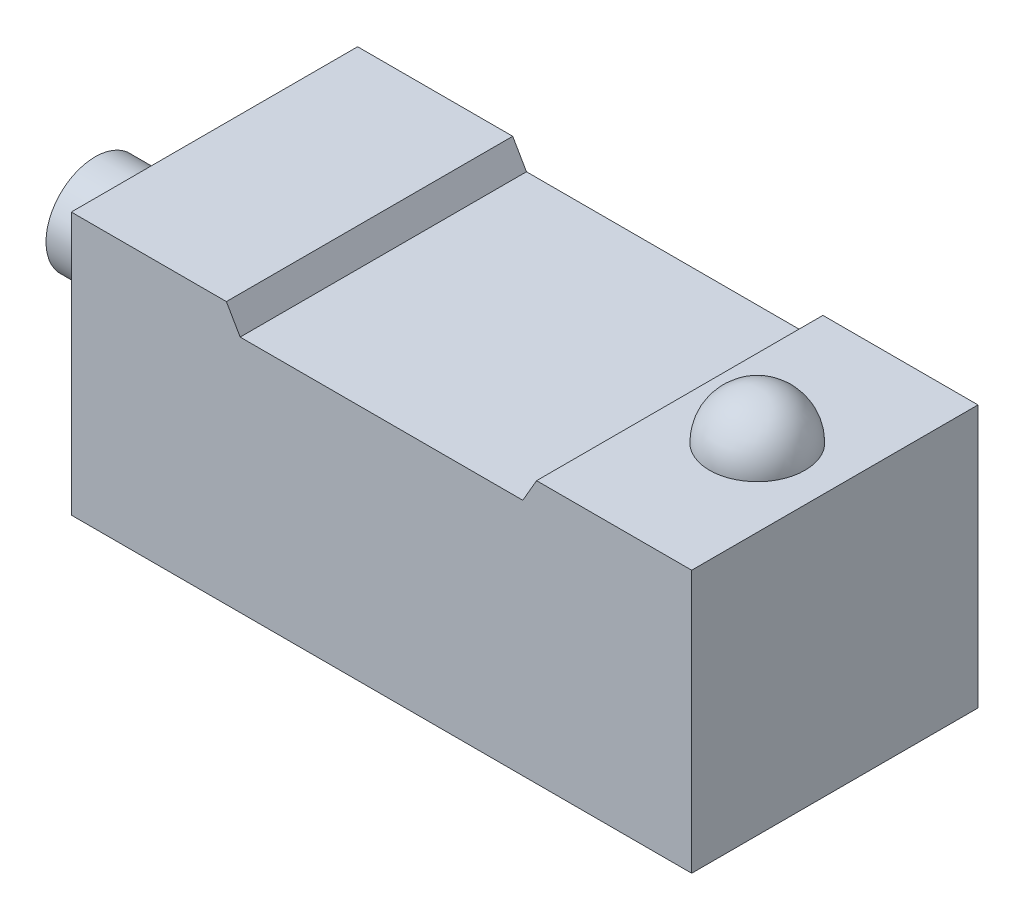
ISO-10303-21;
HEADER;
FILE_DESCRIPTION(('STEP AP214'),'2;1');
FILE_NAME('part.step','',(''),(''),'','','');
FILE_SCHEMA(('AUTOMOTIVE_DESIGN { 1 0 10303 214 1 1 1 1 }'));
ENDSEC;
DATA;
#1=APPLICATION_CONTEXT('core data for automotive mechanical design processes');
#2=APPLICATION_PROTOCOL_DEFINITION('international standard','automotive_design',2000,#1);
#3=PRODUCT_CONTEXT('',#1,'mechanical');
#4=PRODUCT('Part','Part','',(#3));
#5=PRODUCT_RELATED_PRODUCT_CATEGORY('part','',(#4));
#6=PRODUCT_DEFINITION_FORMATION('','',#4);
#7=PRODUCT_DEFINITION_CONTEXT('part definition',#1,'design');
#8=PRODUCT_DEFINITION('design','',#6,#7);
#9=PRODUCT_DEFINITION_SHAPE('','',#8);
#10=(LENGTH_UNIT() NAMED_UNIT(*) SI_UNIT(.MILLI.,.METRE.));
#11=(NAMED_UNIT(*) PLANE_ANGLE_UNIT() SI_UNIT($,.RADIAN.));
#12=(NAMED_UNIT(*) SI_UNIT($,.STERADIAN.) SOLID_ANGLE_UNIT());
#13=UNCERTAINTY_MEASURE_WITH_UNIT(LENGTH_MEASURE(1.E-05),#10,'distance_accuracy_value','');
#14=(GEOMETRIC_REPRESENTATION_CONTEXT(3) GLOBAL_UNCERTAINTY_ASSIGNED_CONTEXT((#13)) GLOBAL_UNIT_ASSIGNED_CONTEXT((#10,
#11,#12)) REPRESENTATION_CONTEXT('',''));
#15=CARTESIAN_POINT('',(0.,0.,0.));
#16=DIRECTION('',(0.,0.,1.));
#17=DIRECTION('',(1.,0.,0.));
#18=AXIS2_PLACEMENT_3D('',#15,#16,#17);
#19=CARTESIAN_POINT('',(-13.,11.,6.));
#20=DIRECTION('',(1.,0.,0.));
#21=DIRECTION('',(0.,0.,-1.));
#22=AXIS2_PLACEMENT_3D('',#19,#20,#21);
#23=PLANE('',#22);
#24=DIRECTION('',(0.,0.,1.));
#25=VECTOR('',#24,1.);
#26=CARTESIAN_POINT('',(-13.,0.,6.));
#27=LINE('',#26,#25);
#28=CARTESIAN_POINT('',(-13.,0.,-6.));
#29=VERTEX_POINT('',#28);
#30=CARTESIAN_POINT('',(-13.,0.,6.));
#31=VERTEX_POINT('',#30);
#32=EDGE_CURVE('E145',#29,#31,#27,.T.);
#33=ORIENTED_EDGE('',*,*,#32,.T.);
#34=DIRECTION('',(0.,-1.,0.));
#35=VECTOR('',#34,1.);
#36=CARTESIAN_POINT('',(-13.,11.,6.));
#37=LINE('',#36,#35);
#38=CARTESIAN_POINT('',(-13.,11.,6.));
#39=VERTEX_POINT('',#38);
#40=EDGE_CURVE('E134',#39,#31,#37,.T.);
#41=ORIENTED_EDGE('',*,*,#40,.F.);
#42=DIRECTION('',(0.,0.,1.));
#43=VECTOR('',#42,1.);
#44=CARTESIAN_POINT('',(-13.,11.,6.));
#45=LINE('',#44,#43);
#46=CARTESIAN_POINT('',(-13.,11.,-6.));
#47=VERTEX_POINT('',#46);
#48=EDGE_CURVE('E130',#47,#39,#45,.T.);
#49=ORIENTED_EDGE('',*,*,#48,.F.);
#50=DIRECTION('',(0.,-1.,0.));
#51=VECTOR('',#50,1.);
#52=CARTESIAN_POINT('',(-13.,11.,-6.));
#53=LINE('',#52,#51);
#54=EDGE_CURVE('E150',#47,#29,#53,.T.);
#55=ORIENTED_EDGE('',*,*,#54,.T.);
#56=EDGE_LOOP('',(#33,#41,#49,#55));
#57=FACE_BOUND('',#56,.T.);
#58=CARTESIAN_POINT('',(-13.,5.44549622085863,0.));
#59=DIRECTION('',(1.,0.,0.));
#60=DIRECTION('',(0.,0.,-1.));
#61=AXIS2_PLACEMENT_3D('',#58,#59,#60);
#62=CIRCLE('',#61,2.06006299232232);
#63=CARTESIAN_POINT('',(-13.,5.44549622085863,-2.06006299232232));
#64=VERTEX_POINT('',#63);
#65=EDGE_CURVE('E11',#64,#64,#62,.F.);
#66=ORIENTED_EDGE('',*,*,#65,.F.);
#67=EDGE_LOOP('',(#66));
#68=FACE_BOUND('',#67,.T.);
#69=ADVANCED_FACE('F34',(#57,#68),#23,.F.);
#70=CARTESIAN_POINT('',(13.,11.,-6.));
#71=DIRECTION('',(0.,-1.,0.));
#72=DIRECTION('',(0.,0.,-1.));
#73=AXIS2_PLACEMENT_3D('',#70,#71,#72);
#74=PLANE('',#73);
#75=DIRECTION('',(-1.,0.,0.));
#76=VECTOR('',#75,1.);
#77=CARTESIAN_POINT('',(-13.,11.,-6.));
#78=LINE('',#77,#76);
#79=CARTESIAN_POINT('',(13.,11.,-6.));
#80=VERTEX_POINT('',#79);
#81=CARTESIAN_POINT('',(6.5,11.,-6.));
#82=VERTEX_POINT('',#81);
#83=EDGE_CURVE('E88',#80,#82,#78,.T.);
#84=ORIENTED_EDGE('',*,*,#83,.T.);
#85=DIRECTION('',(0.,0.,1.));
#86=VECTOR('',#85,1.);
#87=CARTESIAN_POINT('',(6.5,11.,-6.));
#88=LINE('',#87,#86);
#89=CARTESIAN_POINT('',(6.5,11.,6.));
#90=VERTEX_POINT('',#89);
#91=EDGE_CURVE('E117',#82,#90,#88,.T.);
#92=ORIENTED_EDGE('',*,*,#91,.T.);
#93=DIRECTION('',(1.,0.,0.));
#94=VECTOR('',#93,1.);
#95=CARTESIAN_POINT('',(-13.,11.,6.));
#96=LINE('',#95,#94);
#97=CARTESIAN_POINT('',(13.,11.,6.));
#98=VERTEX_POINT('',#97);
#99=EDGE_CURVE('E58',#90,#98,#96,.T.);
#100=ORIENTED_EDGE('',*,*,#99,.T.);
#101=DIRECTION('',(0.,0.,-1.));
#102=VECTOR('',#101,1.);
#103=CARTESIAN_POINT('',(13.,11.,6.));
#104=LINE('',#103,#102);
#105=EDGE_CURVE('E147',#98,#80,#104,.T.);
#106=ORIENTED_EDGE('',*,*,#105,.T.);
#107=EDGE_LOOP('',(#84,#92,#100,#106));
#108=FACE_BOUND('',#107,.T.);
#109=CARTESIAN_POINT('',(9.75,11.,0.));
#110=DIRECTION('',(0.,-1.,0.));
#111=DIRECTION('',(0.,0.,-1.));
#112=AXIS2_PLACEMENT_3D('',#109,#110,#111);
#113=CIRCLE('',#112,2.);
#114=CARTESIAN_POINT('',(9.75,11.,-2.));
#115=VERTEX_POINT('',#114);
#116=EDGE_CURVE('E42',#115,#115,#113,.F.);
#117=ORIENTED_EDGE('',*,*,#116,.F.);
#118=EDGE_LOOP('',(#117));
#119=FACE_BOUND('',#118,.T.);
#120=ADVANCED_FACE('F160',(#108,#119),#74,.F.);
#121=CARTESIAN_POINT('',(13.,11.,6.));
#122=DIRECTION('',(-1.,0.,0.));
#123=DIRECTION('',(0.,0.,1.));
#124=AXIS2_PLACEMENT_3D('',#121,#122,#123);
#125=PLANE('',#124);
#126=DIRECTION('',(0.,0.,-1.));
#127=VECTOR('',#126,1.);
#128=CARTESIAN_POINT('',(13.,0.,6.));
#129=LINE('',#128,#127);
#130=CARTESIAN_POINT('',(13.,0.,6.));
#131=VERTEX_POINT('',#130);
#132=CARTESIAN_POINT('',(13.,0.,-6.));
#133=VERTEX_POINT('',#132);
#134=EDGE_CURVE('E139',#131,#133,#129,.T.);
#135=ORIENTED_EDGE('',*,*,#134,.T.);
#136=DIRECTION('',(0.,-1.,0.));
#137=VECTOR('',#136,1.);
#138=CARTESIAN_POINT('',(13.,11.,-6.));
#139=LINE('',#138,#137);
#140=EDGE_CURVE('E118',#80,#133,#139,.T.);
#141=ORIENTED_EDGE('',*,*,#140,.F.);
#142=ORIENTED_EDGE('',*,*,#105,.F.);
#143=DIRECTION('',(0.,-1.,0.));
#144=VECTOR('',#143,1.);
#145=CARTESIAN_POINT('',(13.,11.,6.));
#146=LINE('',#145,#144);
#147=EDGE_CURVE('E132',#98,#131,#146,.T.);
#148=ORIENTED_EDGE('',*,*,#147,.T.);
#149=EDGE_LOOP('',(#135,#141,#142,#148));
#150=FACE_BOUND('',#149,.T.);
#151=ADVANCED_FACE('F36',(#150),#125,.F.);
#152=CARTESIAN_POINT('',(-13.,11.,-6.));
#153=DIRECTION('',(0.,0.,1.));
#154=DIRECTION('',(1.,0.,0.));
#155=AXIS2_PLACEMENT_3D('',#152,#153,#154);
#156=PLANE('',#155);
#157=DIRECTION('',(1.,0.,0.));
#158=VECTOR('',#157,1.);
#159=CARTESIAN_POINT('',(-13.,10.,-6.));
#160=LINE('',#159,#158);
#161=CARTESIAN_POINT('',(-5.92264973081037,10.,-6.));
#162=VERTEX_POINT('',#161);
#163=CARTESIAN_POINT('',(5.92264973081037,10.,-6.));
#164=VERTEX_POINT('',#163);
#165=EDGE_CURVE('E143',#162,#164,#160,.T.);
#166=ORIENTED_EDGE('',*,*,#165,.T.);
#167=DIRECTION('',(0.500000000000001,0.866025403784438,0.));
#168=VECTOR('',#167,1.);
#169=CARTESIAN_POINT('',(1.62499999999998,2.55625231310171,-6.));
#170=LINE('',#169,#168);
#171=EDGE_CURVE('E188',#164,#82,#170,.T.);
#172=ORIENTED_EDGE('',*,*,#171,.T.);
#173=ORIENTED_EDGE('',*,*,#83,.F.);
#174=ORIENTED_EDGE('',*,*,#140,.T.);
#175=DIRECTION('',(-1.,0.,0.));
#176=VECTOR('',#175,1.);
#177=CARTESIAN_POINT('',(-13.,0.,-6.));
#178=LINE('',#177,#176);
#179=EDGE_CURVE('E142',#133,#29,#178,.T.);
#180=ORIENTED_EDGE('',*,*,#179,.T.);
#181=ORIENTED_EDGE('',*,*,#54,.F.);
#182=CARTESIAN_POINT('',(-6.5,11.,-6.));
#183=VERTEX_POINT('',#182);
#184=EDGE_CURVE('E196',#183,#47,#78,.T.);
#185=ORIENTED_EDGE('',*,*,#184,.F.);
#186=DIRECTION('',(0.500000000000001,-0.866025403784438,0.));
#187=VECTOR('',#186,1.);
#188=CARTESIAN_POINT('',(-8.12500000000001,13.8145825622994,-6.));
#189=LINE('',#188,#187);
#190=EDGE_CURVE('E49',#183,#162,#189,.T.);
#191=ORIENTED_EDGE('',*,*,#190,.T.);
#192=EDGE_LOOP('',(#166,#172,#173,#174,#180,#181,#185,#191));
#193=FACE_BOUND('',#192,.T.);
#194=ADVANCED_FACE('F167',(#193),#156,.F.);
#195=CARTESIAN_POINT('',(-13.,11.,6.));
#196=DIRECTION('',(0.,0.,-1.));
#197=DIRECTION('',(-1.,0.,0.));
#198=AXIS2_PLACEMENT_3D('',#195,#196,#197);
#199=PLANE('',#198);
#200=ORIENTED_EDGE('',*,*,#99,.F.);
#201=DIRECTION('',(-0.500000000000001,-0.866025403784438,0.));
#202=VECTOR('',#201,1.);
#203=CARTESIAN_POINT('',(1.62499999999998,2.55625231310171,6.));
#204=LINE('',#203,#202);
#205=CARTESIAN_POINT('',(5.92264973081037,10.,6.));
#206=VERTEX_POINT('',#205);
#207=EDGE_CURVE('E192',#90,#206,#204,.T.);
#208=ORIENTED_EDGE('',*,*,#207,.T.);
#209=DIRECTION('',(-1.,0.,0.));
#210=VECTOR('',#209,1.);
#211=CARTESIAN_POINT('',(-13.,10.,6.));
#212=LINE('',#211,#210);
#213=CARTESIAN_POINT('',(-5.92264973081037,10.,6.));
#214=VERTEX_POINT('',#213);
#215=EDGE_CURVE('E125',#206,#214,#212,.T.);
#216=ORIENTED_EDGE('',*,*,#215,.T.);
#217=DIRECTION('',(-0.500000000000001,0.866025403784438,0.));
#218=VECTOR('',#217,1.);
#219=CARTESIAN_POINT('',(-8.12500000000001,13.8145825622994,6.));
#220=LINE('',#219,#218);
#221=CARTESIAN_POINT('',(-6.5,11.,6.));
#222=VERTEX_POINT('',#221);
#223=EDGE_CURVE('E112',#214,#222,#220,.T.);
#224=ORIENTED_EDGE('',*,*,#223,.T.);
#225=EDGE_CURVE('E123',#39,#222,#96,.T.);
#226=ORIENTED_EDGE('',*,*,#225,.F.);
#227=ORIENTED_EDGE('',*,*,#40,.T.);
#228=DIRECTION('',(1.,0.,0.));
#229=VECTOR('',#228,1.);
#230=CARTESIAN_POINT('',(-13.,0.,6.));
#231=LINE('',#230,#229);
#232=EDGE_CURVE('E80',#31,#131,#231,.T.);
#233=ORIENTED_EDGE('',*,*,#232,.T.);
#234=ORIENTED_EDGE('',*,*,#147,.F.);
#235=EDGE_LOOP('',(#200,#208,#216,#224,#226,#227,#233,#234));
#236=FACE_BOUND('',#235,.T.);
#237=ADVANCED_FACE('F122',(#236),#199,.F.);
#238=ORIENTED_EDGE('',*,*,#225,.T.);
#239=DIRECTION('',(0.,0.,-1.));
#240=VECTOR('',#239,1.);
#241=CARTESIAN_POINT('',(-6.5,11.,-6.));
#242=LINE('',#241,#240);
#243=EDGE_CURVE('E109',#222,#183,#242,.T.);
#244=ORIENTED_EDGE('',*,*,#243,.T.);
#245=ORIENTED_EDGE('',*,*,#184,.T.);
#246=ORIENTED_EDGE('',*,*,#48,.T.);
#247=EDGE_LOOP('',(#238,#244,#245,#246));
#248=FACE_BOUND('',#247,.T.);
#249=ADVANCED_FACE('F128',(#248),#74,.F.);
#250=CARTESIAN_POINT('',(13.,0.,-6.));
#251=DIRECTION('',(0.,-1.,0.));
#252=DIRECTION('',(0.,0.,-1.));
#253=AXIS2_PLACEMENT_3D('',#250,#251,#252);
#254=PLANE('',#253);
#255=ORIENTED_EDGE('',*,*,#134,.F.);
#256=ORIENTED_EDGE('',*,*,#232,.F.);
#257=ORIENTED_EDGE('',*,*,#32,.F.);
#258=ORIENTED_EDGE('',*,*,#179,.F.);
#259=EDGE_LOOP('',(#255,#256,#257,#258));
#260=FACE_BOUND('',#259,.T.);
#261=ADVANCED_FACE('F174',(#260),#254,.T.);
#262=CARTESIAN_POINT('',(6.5,10.,-7.5));
#263=DIRECTION('',(0.,-1.,0.));
#264=DIRECTION('',(0.,0.,-1.));
#265=AXIS2_PLACEMENT_3D('',#262,#263,#264);
#266=PLANE('',#265);
#267=DIRECTION('',(0.,0.,1.));
#268=VECTOR('',#267,1.);
#269=CARTESIAN_POINT('',(-5.92264973081037,10.,7.5));
#270=LINE('',#269,#268);
#271=EDGE_CURVE('E126',#162,#214,#270,.T.);
#272=ORIENTED_EDGE('',*,*,#271,.T.);
#273=ORIENTED_EDGE('',*,*,#215,.F.);
#274=DIRECTION('',(0.,0.,-1.));
#275=VECTOR('',#274,1.);
#276=CARTESIAN_POINT('',(5.92264973081037,10.,7.5));
#277=LINE('',#276,#275);
#278=EDGE_CURVE('E208',#206,#164,#277,.T.);
#279=ORIENTED_EDGE('',*,*,#278,.T.);
#280=ORIENTED_EDGE('',*,*,#165,.F.);
#281=EDGE_LOOP('',(#272,#273,#279,#280));
#282=FACE_BOUND('',#281,.T.);
#283=ADVANCED_FACE('F179',(#282),#266,.F.);
#284=CARTESIAN_POINT('',(6.5,11.,7.5));
#285=DIRECTION('',(0.866025403784438,-0.500000000000001,0.));
#286=DIRECTION('',(0.500000000000001,0.866025403784438,0.));
#287=AXIS2_PLACEMENT_3D('',#284,#285,#286);
#288=PLANE('',#287);
#289=ORIENTED_EDGE('',*,*,#278,.F.);
#290=ORIENTED_EDGE('',*,*,#207,.F.);
#291=ORIENTED_EDGE('',*,*,#91,.F.);
#292=ORIENTED_EDGE('',*,*,#171,.F.);
#293=EDGE_LOOP('',(#289,#290,#291,#292));
#294=FACE_BOUND('',#293,.T.);
#295=ADVANCED_FACE('F230',(#294),#288,.F.);
#296=CARTESIAN_POINT('',(-6.5,11.,7.5));
#297=DIRECTION('',(-0.866025403784438,-0.500000000000001,0.));
#298=DIRECTION('',(0.500000000000001,-0.866025403784438,0.));
#299=AXIS2_PLACEMENT_3D('',#296,#297,#298);
#300=PLANE('',#299);
#301=ORIENTED_EDGE('',*,*,#243,.F.);
#302=ORIENTED_EDGE('',*,*,#223,.F.);
#303=ORIENTED_EDGE('',*,*,#271,.F.);
#304=ORIENTED_EDGE('',*,*,#190,.F.);
#305=EDGE_LOOP('',(#301,#302,#303,#304));
#306=FACE_BOUND('',#305,.T.);
#307=ADVANCED_FACE('F111',(#306),#300,.F.);
#308=CARTESIAN_POINT('',(9.75,11.,0.));
#309=DIRECTION('',(0.,1.,0.));
#310=DIRECTION('',(1.,0.,0.));
#311=AXIS2_PLACEMENT_3D('',#308,#309,#310);
#312=SPHERICAL_SURFACE('',#311,2.);
#313=ORIENTED_EDGE('',*,*,#116,.T.);
#314=EDGE_LOOP('',(#313));
#315=FACE_BOUND('',#314,.T.);
#316=ADVANCED_FACE('F158',(#315),#312,.T.);
#317=CARTESIAN_POINT('',(-18.,5.44549622085863,0.));
#318=DIRECTION('',(1.,0.,0.));
#319=DIRECTION('',(0.,0.,-1.));
#320=AXIS2_PLACEMENT_3D('',#317,#318,#319);
#321=CYLINDRICAL_SURFACE('',#320,2.06006299232232);
#322=CARTESIAN_POINT('',(-18.,5.44549622085863,0.));
#323=DIRECTION('',(-1.,0.,0.));
#324=DIRECTION('',(0.,0.,1.));
#325=AXIS2_PLACEMENT_3D('',#322,#323,#324);
#326=CIRCLE('',#325,2.06006299232232);
#327=CARTESIAN_POINT('',(-18.,5.44549622085863,2.06006299232232));
#328=VERTEX_POINT('',#327);
#329=EDGE_CURVE('E210',#328,#328,#326,.T.);
#330=ORIENTED_EDGE('',*,*,#329,.F.);
#331=EDGE_LOOP('',(#330));
#332=FACE_BOUND('',#331,.T.);
#333=ORIENTED_EDGE('',*,*,#65,.T.);
#334=EDGE_LOOP('',(#333));
#335=FACE_BOUND('',#334,.T.);
#336=ADVANCED_FACE('F216',(#332,#335),#321,.T.);
#337=CARTESIAN_POINT('',(-18.,5.44549622085863,0.));
#338=DIRECTION('',(-1.,0.,0.));
#339=DIRECTION('',(0.,0.,1.));
#340=AXIS2_PLACEMENT_3D('',#337,#338,#339);
#341=PLANE('',#340);
#342=ORIENTED_EDGE('',*,*,#329,.T.);
#343=EDGE_LOOP('',(#342));
#344=FACE_BOUND('',#343,.T.);
#345=ADVANCED_FACE('F214',(#344),#341,.T.);
#346=CLOSED_SHELL('',(#69,#120,#151,#194,#237,#249,#261,#283,#295,#307,#316,#336,#345));
#347=MANIFOLD_SOLID_BREP('B2',#346);
#348=ADVANCED_BREP_SHAPE_REPRESENTATION('',(#18,#347),#14);
#349=SHAPE_DEFINITION_REPRESENTATION(#9,#348);
ENDSEC;
END-ISO-10303-21;
